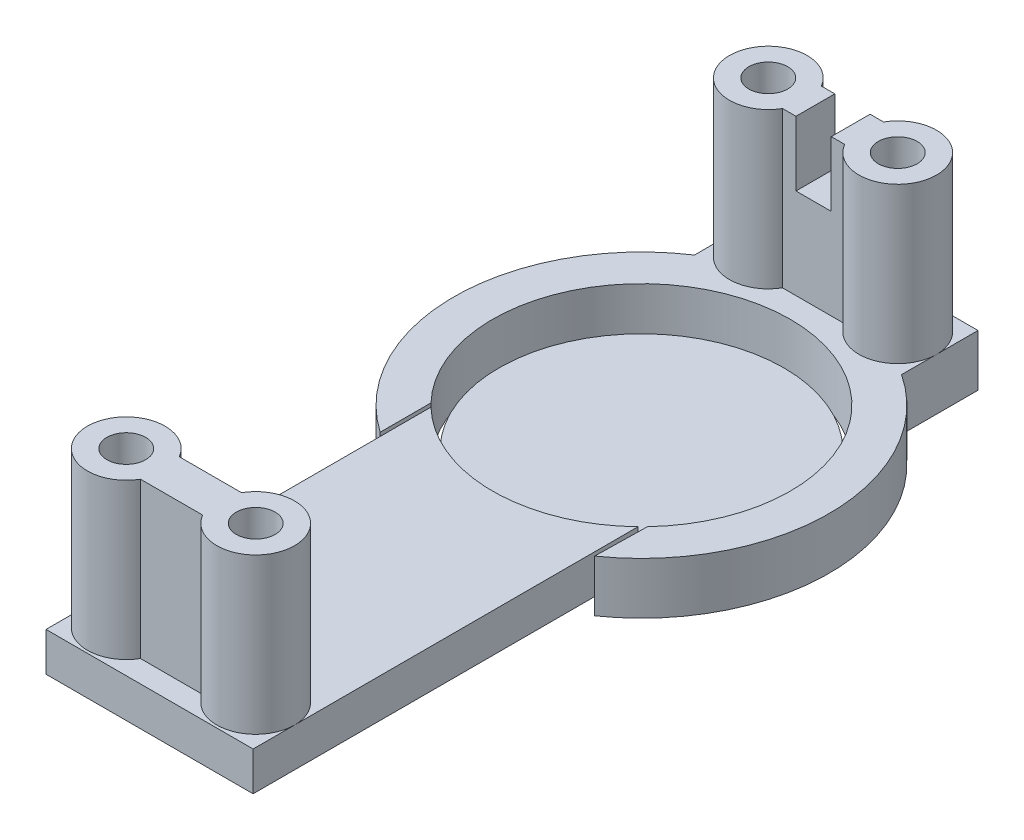
ISO-10303-21;
HEADER;
FILE_DESCRIPTION(('STEP AP214'),'2;1');
FILE_NAME('part.step','',(''),(''),'','','');
FILE_SCHEMA(('AUTOMOTIVE_DESIGN { 1 0 10303 214 1 1 1 1 }'));
ENDSEC;
DATA;
#1=APPLICATION_CONTEXT('core data for automotive mechanical design processes');
#2=APPLICATION_PROTOCOL_DEFINITION('international standard','automotive_design',2000,#1);
#3=PRODUCT_CONTEXT('',#1,'mechanical');
#4=PRODUCT('Part','Part','',(#3));
#5=PRODUCT_RELATED_PRODUCT_CATEGORY('part','',(#4));
#6=PRODUCT_DEFINITION_FORMATION('','',#4);
#7=PRODUCT_DEFINITION_CONTEXT('part definition',#1,'design');
#8=PRODUCT_DEFINITION('design','',#6,#7);
#9=PRODUCT_DEFINITION_SHAPE('','',#8);
#10=(LENGTH_UNIT() NAMED_UNIT(*) SI_UNIT(.MILLI.,.METRE.));
#11=(NAMED_UNIT(*) PLANE_ANGLE_UNIT() SI_UNIT($,.RADIAN.));
#12=(NAMED_UNIT(*) SI_UNIT($,.STERADIAN.) SOLID_ANGLE_UNIT());
#13=UNCERTAINTY_MEASURE_WITH_UNIT(LENGTH_MEASURE(1.E-05),#10,'distance_accuracy_value','');
#14=(GEOMETRIC_REPRESENTATION_CONTEXT(3) GLOBAL_UNCERTAINTY_ASSIGNED_CONTEXT((#13)) GLOBAL_UNIT_ASSIGNED_CONTEXT((#10,
#11,#12)) REPRESENTATION_CONTEXT('',''));
#15=CARTESIAN_POINT('',(0.,0.,0.));
#16=DIRECTION('',(0.,0.,1.));
#17=DIRECTION('',(1.,0.,0.));
#18=AXIS2_PLACEMENT_3D('',#15,#16,#17);
#19=CARTESIAN_POINT('',(0.,-1.,-9.99999999999997));
#20=DIRECTION('',(0.,1.,0.));
#21=DIRECTION('',(0.,0.,1.));
#22=AXIS2_PLACEMENT_3D('',#19,#20,#21);
#23=CYLINDRICAL_SURFACE('',#22,11.);
#24=CARTESIAN_POINT('',(0.,-1.,-9.99999999999997));
#25=DIRECTION('',(0.,-1.,0.));
#26=DIRECTION('',(0.,0.,-1.));
#27=AXIS2_PLACEMENT_3D('',#24,#25,#26);
#28=CIRCLE('',#27,11.);
#29=CARTESIAN_POINT('',(0.,-1.,-21.));
#30=VERTEX_POINT('',#29);
#31=EDGE_CURVE('E11',#30,#30,#28,.T.);
#32=ORIENTED_EDGE('',*,*,#31,.F.);
#33=EDGE_LOOP('',(#32));
#34=FACE_BOUND('',#33,.T.);
#35=CARTESIAN_POINT('',(0.,0.,-9.99999999999997));
#36=DIRECTION('',(0.,-1.,0.));
#37=DIRECTION('',(0.,0.,-1.));
#38=AXIS2_PLACEMENT_3D('',#35,#36,#37);
#39=CIRCLE('',#38,11.);
#40=CARTESIAN_POINT('',(0.,0.,-21.));
#41=VERTEX_POINT('',#40);
#42=EDGE_CURVE('E47',#41,#41,#39,.T.);
#43=ORIENTED_EDGE('',*,*,#42,.T.);
#44=EDGE_LOOP('',(#43));
#45=FACE_BOUND('',#44,.T.);
#46=ADVANCED_FACE('F44',(#34,#45),#23,.T.);
#47=CARTESIAN_POINT('',(0.,-1.,-9.99999999999997));
#48=DIRECTION('',(0.,-1.,0.));
#49=DIRECTION('',(0.,0.,-1.));
#50=AXIS2_PLACEMENT_3D('',#47,#48,#49);
#51=PLANE('',#50);
#52=ORIENTED_EDGE('',*,*,#31,.T.);
#53=EDGE_LOOP('',(#52));
#54=FACE_BOUND('',#53,.T.);
#55=ADVANCED_FACE('F59',(#54),#51,.T.);
#56=CARTESIAN_POINT('',(0.,0.,-9.99999999999997));
#57=DIRECTION('',(0.,-1.,0.));
#58=DIRECTION('',(0.,0.,-1.));
#59=AXIS2_PLACEMENT_3D('',#56,#57,#58);
#60=PLANE('',#59);
#61=ORIENTED_EDGE('',*,*,#42,.F.);
#62=EDGE_LOOP('',(#61));
#63=FACE_BOUND('',#62,.T.);
#64=ADVANCED_FACE('F57',(#63),#60,.F.);
#65=CLOSED_SHELL('',(#46,#55,#64));
#66=MANIFOLD_SOLID_BREP('B2',#65);
#67=CARTESIAN_POINT('',(5.00000000000001,-1.,24.8));
#68=DIRECTION('',(0.,1.,0.));
#69=DIRECTION('',(0.,0.,1.));
#70=AXIS2_PLACEMENT_3D('',#67,#68,#69);
#71=CYLINDRICAL_SURFACE('',#70,1.5);
#72=CARTESIAN_POINT('',(5.00000000000001,-1.,24.8));
#73=DIRECTION('',(0.,-1.,0.));
#74=DIRECTION('',(0.,0.,-1.));
#75=AXIS2_PLACEMENT_3D('',#72,#73,#74);
#76=CIRCLE('',#75,1.5);
#77=CARTESIAN_POINT('',(5.00000000000001,-1.,23.3));
#78=VERTEX_POINT('',#77);
#79=EDGE_CURVE('E43',#78,#78,#76,.T.);
#80=ORIENTED_EDGE('',*,*,#79,.F.);
#81=EDGE_LOOP('',(#80));
#82=FACE_BOUND('',#81,.T.);
#83=CARTESIAN_POINT('',(5.00000000000001,0.,24.8));
#84=DIRECTION('',(0.,-1.,0.));
#85=DIRECTION('',(0.,0.,-1.));
#86=AXIS2_PLACEMENT_3D('',#83,#84,#85);
#87=CIRCLE('',#86,1.5);
#88=CARTESIAN_POINT('',(5.00000000000001,0.,23.3));
#89=VERTEX_POINT('',#88);
#90=EDGE_CURVE('E96',#89,#89,#87,.T.);
#91=ORIENTED_EDGE('',*,*,#90,.T.);
#92=EDGE_LOOP('',(#91));
#93=FACE_BOUND('',#92,.T.);
#94=ADVANCED_FACE('F93',(#82,#93),#71,.T.);
#95=CARTESIAN_POINT('',(5.00000000000001,-1.,24.8));
#96=DIRECTION('',(0.,-1.,0.));
#97=DIRECTION('',(0.,0.,-1.));
#98=AXIS2_PLACEMENT_3D('',#95,#96,#97);
#99=PLANE('',#98);
#100=ORIENTED_EDGE('',*,*,#79,.T.);
#101=EDGE_LOOP('',(#100));
#102=FACE_BOUND('',#101,.T.);
#103=ADVANCED_FACE('F108',(#102),#99,.T.);
#104=CARTESIAN_POINT('',(5.00000000000001,0.,24.8));
#105=DIRECTION('',(0.,-1.,0.));
#106=DIRECTION('',(0.,0.,-1.));
#107=AXIS2_PLACEMENT_3D('',#104,#105,#106);
#108=PLANE('',#107);
#109=ORIENTED_EDGE('',*,*,#90,.F.);
#110=EDGE_LOOP('',(#109));
#111=FACE_BOUND('',#110,.T.);
#112=ADVANCED_FACE('F106',(#111),#108,.F.);
#113=CLOSED_SHELL('',(#94,#103,#112));
#114=MANIFOLD_SOLID_BREP('B6',#113);
#115=CARTESIAN_POINT('',(-4.99999999999999,-1.,24.8));
#116=DIRECTION('',(0.,1.,0.));
#117=DIRECTION('',(0.,0.,1.));
#118=AXIS2_PLACEMENT_3D('',#115,#116,#117);
#119=CYLINDRICAL_SURFACE('',#118,1.5);
#120=CARTESIAN_POINT('',(-4.99999999999999,-1.,24.8));
#121=DIRECTION('',(0.,-1.,0.));
#122=DIRECTION('',(0.,0.,-1.));
#123=AXIS2_PLACEMENT_3D('',#120,#121,#122);
#124=CIRCLE('',#123,1.5);
#125=CARTESIAN_POINT('',(-4.99999999999999,-1.,23.3));
#126=VERTEX_POINT('',#125);
#127=EDGE_CURVE('E92',#126,#126,#124,.T.);
#128=ORIENTED_EDGE('',*,*,#127,.F.);
#129=EDGE_LOOP('',(#128));
#130=FACE_BOUND('',#129,.T.);
#131=CARTESIAN_POINT('',(-4.99999999999999,0.,24.8));
#132=DIRECTION('',(0.,-1.,0.));
#133=DIRECTION('',(0.,0.,-1.));
#134=AXIS2_PLACEMENT_3D('',#131,#132,#133);
#135=CIRCLE('',#134,1.5);
#136=CARTESIAN_POINT('',(-4.99999999999999,0.,23.3));
#137=VERTEX_POINT('',#136);
#138=EDGE_CURVE('E147',#137,#137,#135,.T.);
#139=ORIENTED_EDGE('',*,*,#138,.T.);
#140=EDGE_LOOP('',(#139));
#141=FACE_BOUND('',#140,.T.);
#142=ADVANCED_FACE('F144',(#130,#141),#119,.T.);
#143=CARTESIAN_POINT('',(-4.99999999999999,-1.,24.8));
#144=DIRECTION('',(0.,-1.,0.));
#145=DIRECTION('',(0.,0.,-1.));
#146=AXIS2_PLACEMENT_3D('',#143,#144,#145);
#147=PLANE('',#146);
#148=ORIENTED_EDGE('',*,*,#127,.T.);
#149=EDGE_LOOP('',(#148));
#150=FACE_BOUND('',#149,.T.);
#151=ADVANCED_FACE('F159',(#150),#147,.T.);
#152=CARTESIAN_POINT('',(-4.99999999999999,0.,24.8));
#153=DIRECTION('',(0.,-1.,0.));
#154=DIRECTION('',(0.,0.,-1.));
#155=AXIS2_PLACEMENT_3D('',#152,#153,#154);
#156=PLANE('',#155);
#157=ORIENTED_EDGE('',*,*,#138,.F.);
#158=EDGE_LOOP('',(#157));
#159=FACE_BOUND('',#158,.T.);
#160=ADVANCED_FACE('F157',(#159),#156,.F.);
#161=CLOSED_SHELL('',(#142,#151,#160));
#162=MANIFOLD_SOLID_BREP('B38',#161);
#163=CARTESIAN_POINT('',(0.,15.,0.));
#164=DIRECTION('',(0.,1.,0.));
#165=DIRECTION('',(0.,0.,1.));
#166=AXIS2_PLACEMENT_3D('',#163,#164,#165);
#167=PLANE('',#166);
#168=DIRECTION('',(0.,0.,1.));
#169=VECTOR('',#168,1.);
#170=CARTESIAN_POINT('',(-1.36255157103294,15.,26.3));
#171=LINE('',#170,#169);
#172=CARTESIAN_POINT('',(-1.36255157103294,15.,-26.3));
#173=VERTEX_POINT('',#172);
#174=CARTESIAN_POINT('',(-1.36255157103294,15.,-23.3));
#175=VERTEX_POINT('',#174);
#176=EDGE_CURVE('E362',#173,#175,#171,.T.);
#177=ORIENTED_EDGE('',*,*,#176,.F.);
#178=DIRECTION('',(1.,0.,0.));
#179=VECTOR('',#178,1.);
#180=CARTESIAN_POINT('',(0.,15.,-26.3));
#181=LINE('',#180,#179);
#182=CARTESIAN_POINT('',(-2.40192378864668,15.,-26.3));
#183=VERTEX_POINT('',#182);
#184=EDGE_CURVE('E406',#183,#173,#181,.T.);
#185=ORIENTED_EDGE('',*,*,#184,.F.);
#186=CARTESIAN_POINT('',(-5.,15.,-24.8));
#187=DIRECTION('',(0.,1.,0.));
#188=DIRECTION('',(0.,0.,1.));
#189=AXIS2_PLACEMENT_3D('',#186,#187,#188);
#190=CIRCLE('',#189,3.);
#191=CARTESIAN_POINT('',(-2.40192378864668,15.,-23.3));
#192=VERTEX_POINT('',#191);
#193=EDGE_CURVE('E431',#183,#192,#190,.T.);
#194=ORIENTED_EDGE('',*,*,#193,.T.);
#195=DIRECTION('',(1.,0.,0.));
#196=VECTOR('',#195,1.);
#197=CARTESIAN_POINT('',(0.,15.,-23.3));
#198=LINE('',#197,#196);
#199=EDGE_CURVE('E427',#192,#175,#198,.T.);
#200=ORIENTED_EDGE('',*,*,#199,.T.);
#201=EDGE_LOOP('',(#177,#185,#194,#200));
#202=FACE_BOUND('',#201,.T.);
#203=CARTESIAN_POINT('',(-5.,15.,-24.8));
#204=DIRECTION('',(0.,1.,0.));
#205=DIRECTION('',(0.,0.,1.));
#206=AXIS2_PLACEMENT_3D('',#203,#204,#205);
#207=CIRCLE('',#206,1.5);
#208=CARTESIAN_POINT('',(-5.,15.,-23.3));
#209=VERTEX_POINT('',#208);
#210=EDGE_CURVE('E405',#209,#209,#207,.F.);
#211=ORIENTED_EDGE('',*,*,#210,.T.);
#212=EDGE_LOOP('',(#211));
#213=FACE_BOUND('',#212,.T.);
#214=ADVANCED_FACE('F194',(#202,#213),#167,.T.);
#215=CARTESIAN_POINT('',(0.,3.,0.));
#216=DIRECTION('',(0.,1.,0.));
#217=DIRECTION('',(0.,0.,1.));
#218=AXIS2_PLACEMENT_3D('',#215,#216,#217);
#219=PLANE('',#218);
#220=CARTESIAN_POINT('',(0.,3.,-9.99999999999997));
#221=DIRECTION('',(0.,-1.,0.));
#222=DIRECTION('',(0.,0.,-1.));
#223=AXIS2_PLACEMENT_3D('',#220,#221,#222);
#224=CIRCLE('',#223,11.5);
#225=CARTESIAN_POINT('',(-8.28571428571437,3.,-2.02523111460211));
#226=VERTEX_POINT('',#225);
#227=CARTESIAN_POINT('',(8.36363636363637,3.,-2.10699127221694));
#228=VERTEX_POINT('',#227);
#229=EDGE_CURVE('E217',#226,#228,#224,.T.);
#230=ORIENTED_EDGE('',*,*,#229,.T.);
#231=DIRECTION('',(-0.019445516783248,0.,0.999810918062527));
#232=VECTOR('',#231,1.);
#233=CARTESIAN_POINT('',(8.28571428571429,3.,1.89945119640022));
#234=LINE('',#233,#232);
#235=CARTESIAN_POINT('',(8.28571428571429,3.,1.89945119640022));
#236=VERTEX_POINT('',#235);
#237=EDGE_CURVE('E446',#228,#236,#234,.T.);
#238=ORIENTED_EDGE('',*,*,#237,.T.);
#239=CARTESIAN_POINT('',(0.,3.,-9.99999999999997));
#240=DIRECTION('',(0.,1.,0.));
#241=DIRECTION('',(0.,0.,1.));
#242=AXIS2_PLACEMENT_3D('',#239,#240,#241);
#243=CIRCLE('',#242,14.5);
#244=CARTESIAN_POINT('',(8.,3.,-22.0933866224478));
#245=VERTEX_POINT('',#244);
#246=EDGE_CURVE('E443',#236,#245,#243,.T.);
#247=ORIENTED_EDGE('',*,*,#246,.T.);
#248=DIRECTION('',(0.,0.,-1.));
#249=VECTOR('',#248,1.);
#250=CARTESIAN_POINT('',(8.,3.,-28.));
#251=LINE('',#250,#249);
#252=CARTESIAN_POINT('',(8.,3.,-24.8));
#253=VERTEX_POINT('',#252);
#254=EDGE_CURVE('E445',#245,#253,#251,.T.);
#255=ORIENTED_EDGE('',*,*,#254,.T.);
#256=CARTESIAN_POINT('',(5.,3.,-24.8));
#257=DIRECTION('',(0.,1.,0.));
#258=DIRECTION('',(0.,0.,1.));
#259=AXIS2_PLACEMENT_3D('',#256,#257,#258);
#260=CIRCLE('',#259,3.00000000000001);
#261=CARTESIAN_POINT('',(2.40192378864668,3.,-23.3));
#262=VERTEX_POINT('',#261);
#263=EDGE_CURVE('E395',#262,#253,#260,.T.);
#264=ORIENTED_EDGE('',*,*,#263,.F.);
#265=DIRECTION('',(1.,0.,0.));
#266=VECTOR('',#265,1.);
#267=CARTESIAN_POINT('',(0.,3.,-23.3));
#268=LINE('',#267,#266);
#269=CARTESIAN_POINT('',(-2.40192378864668,3.,-23.3));
#270=VERTEX_POINT('',#269);
#271=EDGE_CURVE('E396',#270,#262,#268,.T.);
#272=ORIENTED_EDGE('',*,*,#271,.F.);
#273=CARTESIAN_POINT('',(-5.,3.,-24.8));
#274=DIRECTION('',(0.,1.,0.));
#275=DIRECTION('',(0.,0.,1.));
#276=AXIS2_PLACEMENT_3D('',#273,#274,#275);
#277=CIRCLE('',#276,3.);
#278=CARTESIAN_POINT('',(-8.,3.,-24.8));
#279=VERTEX_POINT('',#278);
#280=EDGE_CURVE('E410',#279,#270,#277,.T.);
#281=ORIENTED_EDGE('',*,*,#280,.F.);
#282=DIRECTION('',(0.,0.,1.));
#283=VECTOR('',#282,1.);
#284=CARTESIAN_POINT('',(-8.,3.,-28.));
#285=LINE('',#284,#283);
#286=CARTESIAN_POINT('',(-8.,3.,-22.0933866224478));
#287=VERTEX_POINT('',#286);
#288=EDGE_CURVE('E454',#279,#287,#285,.T.);
#289=ORIENTED_EDGE('',*,*,#288,.T.);
#290=CARTESIAN_POINT('',(0.,3.,-9.99999999999997));
#291=DIRECTION('',(0.,1.,0.));
#292=DIRECTION('',(0.,0.,1.));
#293=AXIS2_PLACEMENT_3D('',#290,#291,#292);
#294=CIRCLE('',#293,14.5);
#295=CARTESIAN_POINT('',(-8.28571428571437,3.,1.89945119640022));
#296=VERTEX_POINT('',#295);
#297=EDGE_CURVE('E319',#287,#296,#294,.T.);
#298=ORIENTED_EDGE('',*,*,#297,.T.);
#299=DIRECTION('',(0.,0.,-1.));
#300=VECTOR('',#299,1.);
#301=CARTESIAN_POINT('',(-8.28571428571437,3.,1.89945119640022));
#302=LINE('',#301,#300);
#303=EDGE_CURVE('E324',#296,#226,#302,.T.);
#304=ORIENTED_EDGE('',*,*,#303,.T.);
#305=EDGE_LOOP('',(#230,#238,#247,#255,#264,#272,#281,#289,#298,#304));
#306=FACE_BOUND('',#305,.T.);
#307=ADVANCED_FACE('F458',(#306),#219,.T.);
#308=CARTESIAN_POINT('',(-8.,3.,-28.));
#309=DIRECTION('',(1.,0.,0.));
#310=DIRECTION('',(0.,0.,-1.));
#311=AXIS2_PLACEMENT_3D('',#308,#309,#310);
#312=PLANE('',#311);
#313=DIRECTION('',(0.,-1.,0.));
#314=VECTOR('',#313,1.);
#315=CARTESIAN_POINT('',(-8.,3.,-28.));
#316=LINE('',#315,#314);
#317=CARTESIAN_POINT('',(-8.,3.,-28.));
#318=VERTEX_POINT('',#317);
#319=CARTESIAN_POINT('',(-8.,-1.,-28.));
#320=VERTEX_POINT('',#319);
#321=EDGE_CURVE('E323',#318,#320,#316,.T.);
#322=ORIENTED_EDGE('',*,*,#321,.T.);
#323=DIRECTION('',(0.,0.,-1.));
#324=VECTOR('',#323,1.);
#325=CARTESIAN_POINT('',(-8.,-1.,-22.0933866224478));
#326=LINE('',#325,#324);
#327=CARTESIAN_POINT('',(-8.,-1.,-22.0933866224478));
#328=VERTEX_POINT('',#327);
#329=EDGE_CURVE('E327',#328,#320,#326,.T.);
#330=ORIENTED_EDGE('',*,*,#329,.F.);
#331=DIRECTION('',(0.,1.,0.));
#332=VECTOR('',#331,1.);
#333=CARTESIAN_POINT('',(-8.,0.,-22.0933866224478));
#334=LINE('',#333,#332);
#335=EDGE_CURVE('E313',#328,#287,#334,.T.);
#336=ORIENTED_EDGE('',*,*,#335,.T.);
#337=ORIENTED_EDGE('',*,*,#288,.F.);
#338=EDGE_CURVE('E386',#318,#279,#285,.T.);
#339=ORIENTED_EDGE('',*,*,#338,.F.);
#340=EDGE_LOOP('',(#322,#330,#336,#337,#339));
#341=FACE_BOUND('',#340,.T.);
#342=ADVANCED_FACE('F328',(#341),#312,.F.);
#343=CARTESIAN_POINT('',(-2.40192378864668,3.,-26.3));
#344=VERTEX_POINT('',#343);
#345=EDGE_CURVE('E385',#344,#279,#277,.T.);
#346=ORIENTED_EDGE('',*,*,#345,.F.);
#347=DIRECTION('',(1.,0.,0.));
#348=VECTOR('',#347,1.);
#349=CARTESIAN_POINT('',(0.,3.,-26.3));
#350=LINE('',#349,#348);
#351=CARTESIAN_POINT('',(2.40192378864668,3.,-26.3));
#352=VERTEX_POINT('',#351);
#353=EDGE_CURVE('E388',#344,#352,#350,.T.);
#354=ORIENTED_EDGE('',*,*,#353,.T.);
#355=EDGE_CURVE('E401',#253,#352,#260,.T.);
#356=ORIENTED_EDGE('',*,*,#355,.F.);
#357=CARTESIAN_POINT('',(8.,3.,-28.));
#358=VERTEX_POINT('',#357);
#359=EDGE_CURVE('E391',#253,#358,#251,.T.);
#360=ORIENTED_EDGE('',*,*,#359,.T.);
#361=DIRECTION('',(-1.,0.,0.));
#362=VECTOR('',#361,1.);
#363=CARTESIAN_POINT('',(-8.,3.,-28.));
#364=LINE('',#363,#362);
#365=EDGE_CURVE('E389',#358,#318,#364,.T.);
#366=ORIENTED_EDGE('',*,*,#365,.T.);
#367=ORIENTED_EDGE('',*,*,#338,.T.);
#368=EDGE_LOOP('',(#346,#354,#356,#360,#366,#367));
#369=FACE_BOUND('',#368,.T.);
#370=ADVANCED_FACE('F476',(#369),#219,.T.);
#371=CARTESIAN_POINT('',(8.,3.,-28.));
#372=DIRECTION('',(-1.,0.,0.));
#373=DIRECTION('',(0.,0.,1.));
#374=AXIS2_PLACEMENT_3D('',#371,#372,#373);
#375=PLANE('',#374);
#376=ORIENTED_EDGE('',*,*,#254,.F.);
#377=DIRECTION('',(0.,1.,0.));
#378=VECTOR('',#377,1.);
#379=CARTESIAN_POINT('',(8.00000000000001,0.,-22.0933866224478));
#380=LINE('',#379,#378);
#381=CARTESIAN_POINT('',(8.00000000000001,-1.,-22.0933866224478));
#382=VERTEX_POINT('',#381);
#383=EDGE_CURVE('E437',#382,#245,#380,.T.);
#384=ORIENTED_EDGE('',*,*,#383,.F.);
#385=DIRECTION('',(0.,0.,1.));
#386=VECTOR('',#385,1.);
#387=CARTESIAN_POINT('',(8.,-1.,-28.));
#388=LINE('',#387,#386);
#389=CARTESIAN_POINT('',(8.,-1.,-28.));
#390=VERTEX_POINT('',#389);
#391=EDGE_CURVE('E350',#390,#382,#388,.T.);
#392=ORIENTED_EDGE('',*,*,#391,.F.);
#393=DIRECTION('',(0.,-1.,0.));
#394=VECTOR('',#393,1.);
#395=CARTESIAN_POINT('',(8.,3.,-28.));
#396=LINE('',#395,#394);
#397=EDGE_CURVE('E383',#358,#390,#396,.T.);
#398=ORIENTED_EDGE('',*,*,#397,.F.);
#399=ORIENTED_EDGE('',*,*,#359,.F.);
#400=EDGE_LOOP('',(#376,#384,#392,#398,#399));
#401=FACE_BOUND('',#400,.T.);
#402=ADVANCED_FACE('F196',(#401),#375,.F.);
#403=CARTESIAN_POINT('',(-8.,3.,-28.));
#404=DIRECTION('',(0.,0.,1.));
#405=DIRECTION('',(1.,0.,0.));
#406=AXIS2_PLACEMENT_3D('',#403,#404,#405);
#407=PLANE('',#406);
#408=ORIENTED_EDGE('',*,*,#397,.T.);
#409=DIRECTION('',(1.,0.,0.));
#410=VECTOR('',#409,1.);
#411=CARTESIAN_POINT('',(-8.,-1.,-28.));
#412=LINE('',#411,#410);
#413=EDGE_CURVE('E334',#320,#390,#412,.T.);
#414=ORIENTED_EDGE('',*,*,#413,.F.);
#415=ORIENTED_EDGE('',*,*,#321,.F.);
#416=ORIENTED_EDGE('',*,*,#365,.F.);
#417=EDGE_LOOP('',(#408,#414,#415,#416));
#418=FACE_BOUND('',#417,.T.);
#419=ADVANCED_FACE('F496',(#418),#407,.F.);
#420=CARTESIAN_POINT('',(-5.,3.,-24.8));
#421=DIRECTION('',(0.,-1.,0.));
#422=DIRECTION('',(0.,0.,-1.));
#423=AXIS2_PLACEMENT_3D('',#420,#421,#422);
#424=CYLINDRICAL_SURFACE('',#423,1.5);
#425=ORIENTED_EDGE('',*,*,#210,.F.);
#426=EDGE_LOOP('',(#425));
#427=FACE_BOUND('',#426,.T.);
#428=CARTESIAN_POINT('',(-5.,-1.,-24.8));
#429=DIRECTION('',(0.,-1.,0.));
#430=DIRECTION('',(0.,0.,-1.));
#431=AXIS2_PLACEMENT_3D('',#428,#429,#430);
#432=CIRCLE('',#431,1.5);
#433=CARTESIAN_POINT('',(-5.,-1.,-26.3));
#434=VERTEX_POINT('',#433);
#435=EDGE_CURVE('E342',#434,#434,#432,.T.);
#436=ORIENTED_EDGE('',*,*,#435,.T.);
#437=EDGE_LOOP('',(#436));
#438=FACE_BOUND('',#437,.T.);
#439=ADVANCED_FACE('F540',(#427,#438),#424,.F.);
#440=CARTESIAN_POINT('',(5.,3.,-24.8));
#441=DIRECTION('',(0.,-1.,0.));
#442=DIRECTION('',(0.,0.,-1.));
#443=AXIS2_PLACEMENT_3D('',#440,#441,#442);
#444=CYLINDRICAL_SURFACE('',#443,1.5);
#445=CARTESIAN_POINT('',(5.,15.,-24.8));
#446=DIRECTION('',(0.,1.,0.));
#447=DIRECTION('',(0.,0.,1.));
#448=AXIS2_PLACEMENT_3D('',#445,#446,#447);
#449=CIRCLE('',#448,1.5);
#450=CARTESIAN_POINT('',(5.,15.,-23.3));
#451=VERTEX_POINT('',#450);
#452=EDGE_CURVE('E418',#451,#451,#449,.F.);
#453=ORIENTED_EDGE('',*,*,#452,.F.);
#454=EDGE_LOOP('',(#453));
#455=FACE_BOUND('',#454,.T.);
#456=CARTESIAN_POINT('',(5.,-1.,-24.8));
#457=DIRECTION('',(0.,-1.,0.));
#458=DIRECTION('',(0.,0.,-1.));
#459=AXIS2_PLACEMENT_3D('',#456,#457,#458);
#460=CIRCLE('',#459,1.5);
#461=CARTESIAN_POINT('',(5.,-1.,-26.3));
#462=VERTEX_POINT('',#461);
#463=EDGE_CURVE('E345',#462,#462,#460,.T.);
#464=ORIENTED_EDGE('',*,*,#463,.T.);
#465=EDGE_LOOP('',(#464));
#466=FACE_BOUND('',#465,.T.);
#467=ADVANCED_FACE('F537',(#455,#466),#444,.F.);
#468=CARTESIAN_POINT('',(-5.,15.,-24.8));
#469=DIRECTION('',(0.,-1.,0.));
#470=DIRECTION('',(0.,0.,-1.));
#471=AXIS2_PLACEMENT_3D('',#468,#469,#470);
#472=CYLINDRICAL_SURFACE('',#471,3.);
#473=ORIENTED_EDGE('',*,*,#345,.T.);
#474=ORIENTED_EDGE('',*,*,#280,.T.);
#475=DIRECTION('',(0.,-1.,0.));
#476=VECTOR('',#475,1.);
#477=CARTESIAN_POINT('',(-2.40192378864668,15.,-23.3));
#478=LINE('',#477,#476);
#479=EDGE_CURVE('E392',#192,#270,#478,.T.);
#480=ORIENTED_EDGE('',*,*,#479,.F.);
#481=ORIENTED_EDGE('',*,*,#193,.F.);
#482=DIRECTION('',(0.,-1.,0.));
#483=VECTOR('',#482,1.);
#484=CARTESIAN_POINT('',(-2.40192378864668,15.,-26.3));
#485=LINE('',#484,#483);
#486=EDGE_CURVE('E407',#183,#344,#485,.T.);
#487=ORIENTED_EDGE('',*,*,#486,.T.);
#488=EDGE_LOOP('',(#473,#474,#480,#481,#487));
#489=FACE_BOUND('',#488,.T.);
#490=ADVANCED_FACE('F493',(#489),#472,.T.);
#491=CARTESIAN_POINT('',(0.,15.,-23.3));
#492=DIRECTION('',(0.,0.,-1.));
#493=DIRECTION('',(-1.,0.,0.));
#494=AXIS2_PLACEMENT_3D('',#491,#492,#493);
#495=PLANE('',#494);
#496=DIRECTION('',(1.,0.,0.));
#497=VECTOR('',#496,1.);
#498=CARTESIAN_POINT('',(0.,10.,-23.3));
#499=LINE('',#498,#497);
#500=CARTESIAN_POINT('',(-1.36255157103294,10.,-23.3));
#501=VERTEX_POINT('',#500);
#502=CARTESIAN_POINT('',(1.36255157103295,10.,-23.3));
#503=VERTEX_POINT('',#502);
#504=EDGE_CURVE('E381',#501,#503,#499,.T.);
#505=ORIENTED_EDGE('',*,*,#504,.F.);
#506=DIRECTION('',(0.,1.,0.));
#507=VECTOR('',#506,1.);
#508=CARTESIAN_POINT('',(-1.36255157103294,15.,-23.3));
#509=LINE('',#508,#507);
#510=EDGE_CURVE('E378',#501,#175,#509,.T.);
#511=ORIENTED_EDGE('',*,*,#510,.T.);
#512=ORIENTED_EDGE('',*,*,#199,.F.);
#513=ORIENTED_EDGE('',*,*,#479,.T.);
#514=ORIENTED_EDGE('',*,*,#271,.T.);
#515=DIRECTION('',(0.,-1.,0.));
#516=VECTOR('',#515,1.);
#517=CARTESIAN_POINT('',(2.40192378864668,15.,-23.3));
#518=LINE('',#517,#516);
#519=CARTESIAN_POINT('',(2.40192378864668,15.,-23.3));
#520=VERTEX_POINT('',#519);
#521=EDGE_CURVE('E397',#520,#262,#518,.T.);
#522=ORIENTED_EDGE('',*,*,#521,.F.);
#523=CARTESIAN_POINT('',(1.36255157103295,15.,-23.3));
#524=VERTEX_POINT('',#523);
#525=EDGE_CURVE('E430',#524,#520,#198,.T.);
#526=ORIENTED_EDGE('',*,*,#525,.F.);
#527=DIRECTION('',(0.,-1.,0.));
#528=VECTOR('',#527,1.);
#529=CARTESIAN_POINT('',(1.36255157103295,15.,-23.3));
#530=LINE('',#529,#528);
#531=EDGE_CURVE('E208',#524,#503,#530,.T.);
#532=ORIENTED_EDGE('',*,*,#531,.T.);
#533=EDGE_LOOP('',(#505,#511,#512,#513,#514,#522,#526,#532));
#534=FACE_BOUND('',#533,.T.);
#535=ADVANCED_FACE('F489',(#534),#495,.F.);
#536=CARTESIAN_POINT('',(5.,15.,-24.8));
#537=DIRECTION('',(0.,-1.,0.));
#538=DIRECTION('',(0.,0.,-1.));
#539=AXIS2_PLACEMENT_3D('',#536,#537,#538);
#540=CYLINDRICAL_SURFACE('',#539,3.00000000000001);
#541=ORIENTED_EDGE('',*,*,#263,.T.);
#542=ORIENTED_EDGE('',*,*,#355,.T.);
#543=DIRECTION('',(0.,-1.,0.));
#544=VECTOR('',#543,1.);
#545=CARTESIAN_POINT('',(2.40192378864668,15.,-26.3));
#546=LINE('',#545,#544);
#547=CARTESIAN_POINT('',(2.40192378864668,15.,-26.3));
#548=VERTEX_POINT('',#547);
#549=EDGE_CURVE('E402',#548,#352,#546,.T.);
#550=ORIENTED_EDGE('',*,*,#549,.F.);
#551=CARTESIAN_POINT('',(5.,15.,-24.8));
#552=DIRECTION('',(0.,1.,0.));
#553=DIRECTION('',(0.,0.,1.));
#554=AXIS2_PLACEMENT_3D('',#551,#552,#553);
#555=CIRCLE('',#554,3.00000000000001);
#556=EDGE_CURVE('E422',#520,#548,#555,.T.);
#557=ORIENTED_EDGE('',*,*,#556,.F.);
#558=ORIENTED_EDGE('',*,*,#521,.T.);
#559=EDGE_LOOP('',(#541,#542,#550,#557,#558));
#560=FACE_BOUND('',#559,.T.);
#561=ADVANCED_FACE('F483',(#560),#540,.T.);
#562=CARTESIAN_POINT('',(0.,15.,-26.3));
#563=DIRECTION('',(0.,0.,-1.));
#564=DIRECTION('',(-1.,0.,0.));
#565=AXIS2_PLACEMENT_3D('',#562,#563,#564);
#566=PLANE('',#565);
#567=DIRECTION('',(0.,1.,0.));
#568=VECTOR('',#567,1.);
#569=CARTESIAN_POINT('',(-1.36255157103294,10.,-26.3));
#570=LINE('',#569,#568);
#571=CARTESIAN_POINT('',(-1.36255157103294,10.,-26.3));
#572=VERTEX_POINT('',#571);
#573=EDGE_CURVE('E373',#572,#173,#570,.T.);
#574=ORIENTED_EDGE('',*,*,#573,.F.);
#575=DIRECTION('',(-1.,0.,0.));
#576=VECTOR('',#575,1.);
#577=CARTESIAN_POINT('',(1.36255157103295,10.,-26.3));
#578=LINE('',#577,#576);
#579=CARTESIAN_POINT('',(1.36255157103295,10.,-26.3));
#580=VERTEX_POINT('',#579);
#581=EDGE_CURVE('E368',#580,#572,#578,.T.);
#582=ORIENTED_EDGE('',*,*,#581,.F.);
#583=DIRECTION('',(0.,1.,0.));
#584=VECTOR('',#583,1.);
#585=CARTESIAN_POINT('',(1.36255157103295,10.,-26.3));
#586=LINE('',#585,#584);
#587=CARTESIAN_POINT('',(1.36255157103295,15.,-26.3));
#588=VERTEX_POINT('',#587);
#589=EDGE_CURVE('E371',#580,#588,#586,.T.);
#590=ORIENTED_EDGE('',*,*,#589,.T.);
#591=EDGE_CURVE('E400',#588,#548,#181,.T.);
#592=ORIENTED_EDGE('',*,*,#591,.T.);
#593=ORIENTED_EDGE('',*,*,#549,.T.);
#594=ORIENTED_EDGE('',*,*,#353,.F.);
#595=ORIENTED_EDGE('',*,*,#486,.F.);
#596=ORIENTED_EDGE('',*,*,#184,.T.);
#597=EDGE_LOOP('',(#574,#582,#590,#592,#593,#594,#595,#596));
#598=FACE_BOUND('',#597,.T.);
#599=ADVANCED_FACE('F525',(#598),#566,.T.);
#600=DIRECTION('',(0.,0.,-1.));
#601=VECTOR('',#600,1.);
#602=CARTESIAN_POINT('',(1.36255157103295,15.,0.));
#603=LINE('',#602,#601);
#604=EDGE_CURVE('E142',#524,#588,#603,.T.);
#605=ORIENTED_EDGE('',*,*,#604,.F.);
#606=ORIENTED_EDGE('',*,*,#525,.T.);
#607=ORIENTED_EDGE('',*,*,#556,.T.);
#608=ORIENTED_EDGE('',*,*,#591,.F.);
#609=EDGE_LOOP('',(#605,#606,#607,#608));
#610=FACE_BOUND('',#609,.T.);
#611=ORIENTED_EDGE('',*,*,#452,.T.);
#612=EDGE_LOOP('',(#611));
#613=FACE_BOUND('',#612,.T.);
#614=ADVANCED_FACE('F514',(#610,#613),#167,.T.);
#615=CARTESIAN_POINT('',(0.,0.,-9.99999999999997));
#616=DIRECTION('',(0.,1.,0.));
#617=DIRECTION('',(0.,0.,1.));
#618=AXIS2_PLACEMENT_3D('',#615,#616,#617);
#619=CYLINDRICAL_SURFACE('',#618,11.5);
#620=DIRECTION('',(0.,1.,0.));
#621=VECTOR('',#620,1.);
#622=CARTESIAN_POINT('',(8.36363636363637,0.,-2.10699127221694));
#623=LINE('',#622,#621);
#624=CARTESIAN_POINT('',(8.36363636363637,-1.,-2.10699127221694));
#625=VERTEX_POINT('',#624);
#626=EDGE_CURVE('E421',#625,#228,#623,.T.);
#627=ORIENTED_EDGE('',*,*,#626,.T.);
#628=ORIENTED_EDGE('',*,*,#229,.F.);
#629=DIRECTION('',(0.,1.,0.));
#630=VECTOR('',#629,1.);
#631=CARTESIAN_POINT('',(-8.28571428571437,0.,-2.02523111460211));
#632=LINE('',#631,#630);
#633=CARTESIAN_POINT('',(-8.28571428571437,-1.,-2.02523111460211));
#634=VERTEX_POINT('',#633);
#635=EDGE_CURVE('E202',#634,#226,#632,.T.);
#636=ORIENTED_EDGE('',*,*,#635,.F.);
#637=CARTESIAN_POINT('',(0.,-1.,-9.99999999999997));
#638=DIRECTION('',(0.,1.,0.));
#639=DIRECTION('',(0.,0.,-1.));
#640=AXIS2_PLACEMENT_3D('',#637,#638,#639);
#641=CIRCLE('',#640,11.5);
#642=EDGE_CURVE('E359',#625,#634,#641,.T.);
#643=ORIENTED_EDGE('',*,*,#642,.F.);
#644=EDGE_LOOP('',(#627,#628,#636,#643));
#645=FACE_BOUND('',#644,.T.);
#646=ADVANCED_FACE('F462',(#645),#619,.F.);
#647=CARTESIAN_POINT('',(0.,0.,-9.99999999999997));
#648=DIRECTION('',(0.,1.,0.));
#649=DIRECTION('',(0.,0.,1.));
#650=AXIS2_PLACEMENT_3D('',#647,#648,#649);
#651=CYLINDRICAL_SURFACE('',#650,14.5);
#652=ORIENTED_EDGE('',*,*,#246,.F.);
#653=DIRECTION('',(0.,1.,0.));
#654=VECTOR('',#653,1.);
#655=CARTESIAN_POINT('',(8.28571428571429,0.,1.89945119640022));
#656=LINE('',#655,#654);
#657=CARTESIAN_POINT('',(8.28571428571429,-1.,1.89945119640022));
#658=VERTEX_POINT('',#657);
#659=EDGE_CURVE('E438',#658,#236,#656,.T.);
#660=ORIENTED_EDGE('',*,*,#659,.F.);
#661=CARTESIAN_POINT('',(0.,-1.,-9.99999999999997));
#662=DIRECTION('',(0.,-1.,0.));
#663=DIRECTION('',(0.,0.,-1.));
#664=AXIS2_PLACEMENT_3D('',#661,#662,#663);
#665=CIRCLE('',#664,14.5);
#666=EDGE_CURVE('E353',#382,#658,#665,.T.);
#667=ORIENTED_EDGE('',*,*,#666,.F.);
#668=ORIENTED_EDGE('',*,*,#383,.T.);
#669=EDGE_LOOP('',(#652,#660,#667,#668));
#670=FACE_BOUND('',#669,.T.);
#671=ADVANCED_FACE('F469',(#670),#651,.T.);
#672=CARTESIAN_POINT('',(8.28571428571429,0.,1.89945119640022));
#673=DIRECTION('',(-0.999810918062527,0.,-0.019445516783248));
#674=DIRECTION('',(-0.019445516783248,0.,0.999810918062527));
#675=AXIS2_PLACEMENT_3D('',#672,#673,#674);
#676=PLANE('',#675);
#677=ORIENTED_EDGE('',*,*,#237,.F.);
#678=ORIENTED_EDGE('',*,*,#626,.F.);
#679=DIRECTION('',(0.019445516783248,0.,-0.999810918062527));
#680=VECTOR('',#679,1.);
#681=CARTESIAN_POINT('',(8.28571428571429,-1.,1.89945119640022));
#682=LINE('',#681,#680);
#683=EDGE_CURVE('E356',#658,#625,#682,.T.);
#684=ORIENTED_EDGE('',*,*,#683,.F.);
#685=ORIENTED_EDGE('',*,*,#659,.T.);
#686=EDGE_LOOP('',(#677,#678,#684,#685));
#687=FACE_BOUND('',#686,.T.);
#688=ADVANCED_FACE('F465',(#687),#676,.T.);
#689=CARTESIAN_POINT('',(0.,0.,-9.99999999999997));
#690=DIRECTION('',(0.,1.,0.));
#691=DIRECTION('',(0.,0.,1.));
#692=AXIS2_PLACEMENT_3D('',#689,#690,#691);
#693=CYLINDRICAL_SURFACE('',#692,14.5);
#694=ORIENTED_EDGE('',*,*,#297,.F.);
#695=ORIENTED_EDGE('',*,*,#335,.F.);
#696=CARTESIAN_POINT('',(0.,-1.,-9.99999999999997));
#697=DIRECTION('',(0.,-1.,0.));
#698=DIRECTION('',(0.,0.,-1.));
#699=AXIS2_PLACEMENT_3D('',#696,#697,#698);
#700=CIRCLE('',#699,14.5);
#701=CARTESIAN_POINT('',(-8.28571428571437,-1.,1.89945119640022));
#702=VERTEX_POINT('',#701);
#703=EDGE_CURVE('E317',#702,#328,#700,.T.);
#704=ORIENTED_EDGE('',*,*,#703,.F.);
#705=DIRECTION('',(0.,1.,0.));
#706=VECTOR('',#705,1.);
#707=CARTESIAN_POINT('',(-8.28571428571437,0.,1.89945119640022));
#708=LINE('',#707,#706);
#709=EDGE_CURVE('E440',#702,#296,#708,.T.);
#710=ORIENTED_EDGE('',*,*,#709,.T.);
#711=EDGE_LOOP('',(#694,#695,#704,#710));
#712=FACE_BOUND('',#711,.T.);
#713=ADVANCED_FACE('F315',(#712),#693,.T.);
#714=CARTESIAN_POINT('',(-8.28571428571437,0.,1.89945119640022));
#715=DIRECTION('',(1.,0.,0.));
#716=DIRECTION('',(0.,0.,-1.));
#717=AXIS2_PLACEMENT_3D('',#714,#715,#716);
#718=PLANE('',#717);
#719=ORIENTED_EDGE('',*,*,#303,.F.);
#720=ORIENTED_EDGE('',*,*,#709,.F.);
#721=DIRECTION('',(0.,0.,1.));
#722=VECTOR('',#721,1.);
#723=CARTESIAN_POINT('',(-8.28571428571437,-1.,-2.02523111460211));
#724=LINE('',#723,#722);
#725=EDGE_CURVE('E341',#634,#702,#724,.T.);
#726=ORIENTED_EDGE('',*,*,#725,.F.);
#727=ORIENTED_EDGE('',*,*,#635,.T.);
#728=EDGE_LOOP('',(#719,#720,#726,#727));
#729=FACE_BOUND('',#728,.T.);
#730=ADVANCED_FACE('F498',(#729),#718,.T.);
#731=CARTESIAN_POINT('',(0.,10.,0.));
#732=DIRECTION('',(0.,1.,0.));
#733=DIRECTION('',(0.,0.,1.));
#734=AXIS2_PLACEMENT_3D('',#731,#732,#733);
#735=PLANE('',#734);
#736=ORIENTED_EDGE('',*,*,#504,.T.);
#737=DIRECTION('',(0.,0.,-1.));
#738=VECTOR('',#737,1.);
#739=CARTESIAN_POINT('',(1.36255157103295,10.,26.3));
#740=LINE('',#739,#738);
#741=EDGE_CURVE('E366',#503,#580,#740,.T.);
#742=ORIENTED_EDGE('',*,*,#741,.T.);
#743=ORIENTED_EDGE('',*,*,#581,.T.);
#744=DIRECTION('',(0.,0.,1.));
#745=VECTOR('',#744,1.);
#746=CARTESIAN_POINT('',(-1.36255157103294,10.,26.3));
#747=LINE('',#746,#745);
#748=EDGE_CURVE('E363',#572,#501,#747,.T.);
#749=ORIENTED_EDGE('',*,*,#748,.T.);
#750=EDGE_LOOP('',(#736,#742,#743,#749));
#751=FACE_BOUND('',#750,.T.);
#752=ADVANCED_FACE('F500',(#751),#735,.T.);
#753=CARTESIAN_POINT('',(-1.36255157103294,10.,26.3));
#754=DIRECTION('',(-1.,0.,0.));
#755=DIRECTION('',(0.,0.,1.));
#756=AXIS2_PLACEMENT_3D('',#753,#754,#755);
#757=PLANE('',#756);
#758=ORIENTED_EDGE('',*,*,#748,.F.);
#759=ORIENTED_EDGE('',*,*,#573,.T.);
#760=ORIENTED_EDGE('',*,*,#176,.T.);
#761=ORIENTED_EDGE('',*,*,#510,.F.);
#762=EDGE_LOOP('',(#758,#759,#760,#761));
#763=FACE_BOUND('',#762,.T.);
#764=ADVANCED_FACE('F506',(#763),#757,.F.);
#765=CARTESIAN_POINT('',(1.36255157103295,10.,26.3));
#766=DIRECTION('',(1.,0.,0.));
#767=DIRECTION('',(0.,0.,-1.));
#768=AXIS2_PLACEMENT_3D('',#765,#766,#767);
#769=PLANE('',#768);
#770=ORIENTED_EDGE('',*,*,#604,.T.);
#771=ORIENTED_EDGE('',*,*,#589,.F.);
#772=ORIENTED_EDGE('',*,*,#741,.F.);
#773=ORIENTED_EDGE('',*,*,#531,.F.);
#774=EDGE_LOOP('',(#770,#771,#772,#773));
#775=FACE_BOUND('',#774,.T.);
#776=ADVANCED_FACE('F545',(#775),#769,.F.);
#777=CARTESIAN_POINT('',(0.,-1.,-9.99999999999997));
#778=DIRECTION('',(0.,-1.,0.));
#779=DIRECTION('',(0.,0.,-1.));
#780=AXIS2_PLACEMENT_3D('',#777,#778,#779);
#781=PLANE('',#780);
#782=ORIENTED_EDGE('',*,*,#435,.F.);
#783=EDGE_LOOP('',(#782));
#784=FACE_BOUND('',#783,.T.);
#785=ORIENTED_EDGE('',*,*,#703,.T.);
#786=ORIENTED_EDGE('',*,*,#329,.T.);
#787=ORIENTED_EDGE('',*,*,#413,.T.);
#788=ORIENTED_EDGE('',*,*,#391,.T.);
#789=ORIENTED_EDGE('',*,*,#666,.T.);
#790=ORIENTED_EDGE('',*,*,#683,.T.);
#791=ORIENTED_EDGE('',*,*,#642,.T.);
#792=ORIENTED_EDGE('',*,*,#725,.T.);
#793=EDGE_LOOP('',(#785,#786,#787,#788,#789,#790,#791,#792));
#794=FACE_BOUND('',#793,.T.);
#795=ORIENTED_EDGE('',*,*,#463,.F.);
#796=EDGE_LOOP('',(#795));
#797=FACE_BOUND('',#796,.T.);
#798=ADVANCED_FACE('F337',(#784,#794,#797),#781,.T.);
#799=CLOSED_SHELL('',(#214,#307,#342,#370,#402,#419,#439,#467,#490,#535,#561,#599,#614,#646,
#671,#688,#713,#730,#752,#764,#776,#798));
#800=MANIFOLD_SOLID_BREP('B87',#799);
#801=CARTESIAN_POINT('',(0.,15.,0.));
#802=DIRECTION('',(0.,1.,0.));
#803=DIRECTION('',(0.,0.,1.));
#804=AXIS2_PLACEMENT_3D('',#801,#802,#803);
#805=PLANE('',#804);
#806=CARTESIAN_POINT('',(-4.99999999999999,15.,24.8));
#807=DIRECTION('',(0.,1.,0.));
#808=DIRECTION('',(0.,0.,1.));
#809=AXIS2_PLACEMENT_3D('',#806,#807,#808);
#810=CIRCLE('',#809,1.5);
#811=CARTESIAN_POINT('',(-4.99999999999999,15.,26.3));
#812=VERTEX_POINT('',#811);
#813=EDGE_CURVE('E901',#812,#812,#810,.F.);
#814=ORIENTED_EDGE('',*,*,#813,.T.);
#815=EDGE_LOOP('',(#814));
#816=FACE_BOUND('',#815,.T.);
#817=CARTESIAN_POINT('',(-4.99999999999999,15.,24.8));
#818=DIRECTION('',(0.,1.,0.));
#819=DIRECTION('',(0.,0.,1.));
#820=AXIS2_PLACEMENT_3D('',#817,#818,#819);
#821=CIRCLE('',#820,3.00000000000001);
#822=CARTESIAN_POINT('',(-2.40192378864667,15.,23.3));
#823=VERTEX_POINT('',#822);
#824=CARTESIAN_POINT('',(-2.40192378864667,15.,26.3));
#825=VERTEX_POINT('',#824);
#826=EDGE_CURVE('E918',#823,#825,#821,.T.);
#827=ORIENTED_EDGE('',*,*,#826,.T.);
#828=DIRECTION('',(1.,0.,0.));
#829=VECTOR('',#828,1.);
#830=CARTESIAN_POINT('',(0.,15.,26.3));
#831=LINE('',#830,#829);
#832=CARTESIAN_POINT('',(2.40192378864668,15.,26.3));
#833=VERTEX_POINT('',#832);
#834=EDGE_CURVE('E916',#825,#833,#831,.T.);
#835=ORIENTED_EDGE('',*,*,#834,.T.);
#836=CARTESIAN_POINT('',(5.00000000000001,15.,24.8));
#837=DIRECTION('',(0.,1.,0.));
#838=DIRECTION('',(0.,0.,1.));
#839=AXIS2_PLACEMENT_3D('',#836,#837,#838);
#840=CIRCLE('',#839,3.);
#841=CARTESIAN_POINT('',(2.40192378864668,15.,23.3));
#842=VERTEX_POINT('',#841);
#843=EDGE_CURVE('E914',#833,#842,#840,.T.);
#844=ORIENTED_EDGE('',*,*,#843,.T.);
#845=DIRECTION('',(1.,0.,0.));
#846=VECTOR('',#845,1.);
#847=CARTESIAN_POINT('',(0.,15.,23.3));
#848=LINE('',#847,#846);
#849=EDGE_CURVE('E911',#823,#842,#848,.T.);
#850=ORIENTED_EDGE('',*,*,#849,.F.);
#851=EDGE_LOOP('',(#827,#835,#844,#850));
#852=FACE_BOUND('',#851,.T.);
#853=CARTESIAN_POINT('',(5.00000000000001,15.,24.8));
#854=DIRECTION('',(0.,1.,0.));
#855=DIRECTION('',(0.,0.,1.));
#856=AXIS2_PLACEMENT_3D('',#853,#854,#855);
#857=CIRCLE('',#856,1.5);
#858=CARTESIAN_POINT('',(5.00000000000001,15.,26.3));
#859=VERTEX_POINT('',#858);
#860=EDGE_CURVE('E898',#859,#859,#857,.F.);
#861=ORIENTED_EDGE('',*,*,#860,.T.);
#862=EDGE_LOOP('',(#861));
#863=FACE_BOUND('',#862,.T.);
#864=ADVANCED_FACE('F770',(#816,#852,#863),#805,.T.);
#865=CARTESIAN_POINT('',(0.,15.,26.3));
#866=DIRECTION('',(0.,0.,-1.));
#867=DIRECTION('',(-1.,0.,0.));
#868=AXIS2_PLACEMENT_3D('',#865,#866,#867);
#869=PLANE('',#868);
#870=DIRECTION('',(1.,0.,0.));
#871=VECTOR('',#870,1.);
#872=CARTESIAN_POINT('',(0.,3.,26.3));
#873=LINE('',#872,#871);
#874=CARTESIAN_POINT('',(-2.40192378864667,3.,26.3));
#875=VERTEX_POINT('',#874);
#876=CARTESIAN_POINT('',(2.40192378864669,3.,26.3));
#877=VERTEX_POINT('',#876);
#878=EDGE_CURVE('E904',#875,#877,#873,.T.);
#879=ORIENTED_EDGE('',*,*,#878,.T.);
#880=DIRECTION('',(0.,-1.,0.));
#881=VECTOR('',#880,1.);
#882=CARTESIAN_POINT('',(2.40192378864668,15.,26.3));
#883=LINE('',#882,#881);
#884=EDGE_CURVE('E889',#833,#877,#883,.T.);
#885=ORIENTED_EDGE('',*,*,#884,.F.);
#886=ORIENTED_EDGE('',*,*,#834,.F.);
#887=DIRECTION('',(0.,-1.,0.));
#888=VECTOR('',#887,1.);
#889=CARTESIAN_POINT('',(-2.40192378864667,15.,26.3));
#890=LINE('',#889,#888);
#891=EDGE_CURVE('E886',#825,#875,#890,.T.);
#892=ORIENTED_EDGE('',*,*,#891,.T.);
#893=EDGE_LOOP('',(#879,#885,#886,#892));
#894=FACE_BOUND('',#893,.T.);
#895=ADVANCED_FACE('F947',(#894),#869,.F.);
#896=CARTESIAN_POINT('',(5.00000000000001,15.,24.8));
#897=DIRECTION('',(0.,-1.,0.));
#898=DIRECTION('',(0.,0.,-1.));
#899=AXIS2_PLACEMENT_3D('',#896,#897,#898);
#900=CYLINDRICAL_SURFACE('',#899,3.);
#901=CARTESIAN_POINT('',(5.00000000000001,3.,24.8));
#902=DIRECTION('',(0.,1.,0.));
#903=DIRECTION('',(0.,0.,1.));
#904=AXIS2_PLACEMENT_3D('',#901,#902,#903);
#905=CIRCLE('',#904,3.);
#906=CARTESIAN_POINT('',(8.00000000000001,3.,24.8));
#907=VERTEX_POINT('',#906);
#908=EDGE_CURVE('E793',#877,#907,#905,.T.);
#909=ORIENTED_EDGE('',*,*,#908,.T.);
#910=CARTESIAN_POINT('',(2.40192378864668,3.,23.3));
#911=VERTEX_POINT('',#910);
#912=EDGE_CURVE('E903',#907,#911,#905,.T.);
#913=ORIENTED_EDGE('',*,*,#912,.T.);
#914=DIRECTION('',(0.,-1.,0.));
#915=VECTOR('',#914,1.);
#916=CARTESIAN_POINT('',(2.40192378864668,15.,23.3));
#917=LINE('',#916,#915);
#918=EDGE_CURVE('E892',#842,#911,#917,.T.);
#919=ORIENTED_EDGE('',*,*,#918,.F.);
#920=ORIENTED_EDGE('',*,*,#843,.F.);
#921=ORIENTED_EDGE('',*,*,#884,.T.);
#922=EDGE_LOOP('',(#909,#913,#919,#920,#921));
#923=FACE_BOUND('',#922,.T.);
#924=ADVANCED_FACE('F939',(#923),#900,.T.);
#925=CARTESIAN_POINT('',(0.,15.,23.3));
#926=DIRECTION('',(0.,0.,-1.));
#927=DIRECTION('',(-1.,0.,0.));
#928=AXIS2_PLACEMENT_3D('',#925,#926,#927);
#929=PLANE('',#928);
#930=DIRECTION('',(1.,0.,0.));
#931=VECTOR('',#930,1.);
#932=CARTESIAN_POINT('',(0.,3.,23.3));
#933=LINE('',#932,#931);
#934=CARTESIAN_POINT('',(-2.40192378864667,3.,23.3));
#935=VERTEX_POINT('',#934);
#936=EDGE_CURVE('E899',#935,#911,#933,.T.);
#937=ORIENTED_EDGE('',*,*,#936,.F.);
#938=DIRECTION('',(0.,-1.,0.));
#939=VECTOR('',#938,1.);
#940=CARTESIAN_POINT('',(-2.40192378864667,15.,23.3));
#941=LINE('',#940,#939);
#942=EDGE_CURVE('E895',#823,#935,#941,.T.);
#943=ORIENTED_EDGE('',*,*,#942,.F.);
#944=ORIENTED_EDGE('',*,*,#849,.T.);
#945=ORIENTED_EDGE('',*,*,#918,.T.);
#946=EDGE_LOOP('',(#937,#943,#944,#945));
#947=FACE_BOUND('',#946,.T.);
#948=ADVANCED_FACE('F941',(#947),#929,.T.);
#949=CARTESIAN_POINT('',(-4.99999999999999,15.,24.8));
#950=DIRECTION('',(0.,-1.,0.));
#951=DIRECTION('',(0.,0.,-1.));
#952=AXIS2_PLACEMENT_3D('',#949,#950,#951);
#953=CYLINDRICAL_SURFACE('',#952,3.00000000000001);
#954=CARTESIAN_POINT('',(-4.99999999999999,3.,24.8));
#955=DIRECTION('',(0.,1.,0.));
#956=DIRECTION('',(0.,0.,1.));
#957=AXIS2_PLACEMENT_3D('',#954,#955,#956);
#958=CIRCLE('',#957,3.00000000000001);
#959=CARTESIAN_POINT('',(-7.99999999999999,3.,24.8));
#960=VERTEX_POINT('',#959);
#961=EDGE_CURVE('E906',#935,#960,#958,.T.);
#962=ORIENTED_EDGE('',*,*,#961,.T.);
#963=EDGE_CURVE('E848',#960,#875,#958,.T.);
#964=ORIENTED_EDGE('',*,*,#963,.T.);
#965=ORIENTED_EDGE('',*,*,#891,.F.);
#966=ORIENTED_EDGE('',*,*,#826,.F.);
#967=ORIENTED_EDGE('',*,*,#942,.T.);
#968=EDGE_LOOP('',(#962,#964,#965,#966,#967));
#969=FACE_BOUND('',#968,.T.);
#970=ADVANCED_FACE('F931',(#969),#953,.T.);
#971=CARTESIAN_POINT('',(-4.99999999999999,3.,24.8));
#972=DIRECTION('',(0.,-1.,0.));
#973=DIRECTION('',(0.,0.,-1.));
#974=AXIS2_PLACEMENT_3D('',#971,#972,#973);
#975=CYLINDRICAL_SURFACE('',#974,1.5);
#976=CARTESIAN_POINT('',(-4.99999999999999,0.,24.8));
#977=DIRECTION('',(0.,1.,0.));
#978=DIRECTION('',(0.,0.,1.));
#979=AXIS2_PLACEMENT_3D('',#976,#977,#978);
#980=CIRCLE('',#979,1.5);
#981=CARTESIAN_POINT('',(-4.99999999999999,0.,26.3));
#982=VERTEX_POINT('',#981);
#983=EDGE_CURVE('E868',#982,#982,#980,.T.);
#984=ORIENTED_EDGE('',*,*,#983,.F.);
#985=EDGE_LOOP('',(#984));
#986=FACE_BOUND('',#985,.T.);
#987=ORIENTED_EDGE('',*,*,#813,.F.);
#988=EDGE_LOOP('',(#987));
#989=FACE_BOUND('',#988,.T.);
#990=ADVANCED_FACE('F960',(#986,#989),#975,.F.);
#991=CARTESIAN_POINT('',(5.00000000000001,3.,24.8));
#992=DIRECTION('',(0.,-1.,0.));
#993=DIRECTION('',(0.,0.,-1.));
#994=AXIS2_PLACEMENT_3D('',#991,#992,#993);
#995=CYLINDRICAL_SURFACE('',#994,1.5);
#996=CARTESIAN_POINT('',(5.00000000000001,0.,24.8));
#997=DIRECTION('',(0.,1.,0.));
#998=DIRECTION('',(0.,0.,1.));
#999=AXIS2_PLACEMENT_3D('',#996,#997,#998);
#1000=CIRCLE('',#999,1.5);
#1001=CARTESIAN_POINT('',(5.00000000000001,0.,26.3));
#1002=VERTEX_POINT('',#1001);
#1003=EDGE_CURVE('E863',#1002,#1002,#1000,.T.);
#1004=ORIENTED_EDGE('',*,*,#1003,.F.);
#1005=EDGE_LOOP('',(#1004));
#1006=FACE_BOUND('',#1005,.T.);
#1007=ORIENTED_EDGE('',*,*,#860,.F.);
#1008=EDGE_LOOP('',(#1007));
#1009=FACE_BOUND('',#1008,.T.);
#1010=ADVANCED_FACE('F951',(#1006,#1009),#995,.F.);
#1011=CARTESIAN_POINT('',(0.,3.,0.));
#1012=DIRECTION('',(0.,1.,0.));
#1013=DIRECTION('',(0.,0.,1.));
#1014=AXIS2_PLACEMENT_3D('',#1011,#1012,#1013);
#1015=PLANE('',#1014);
#1016=ORIENTED_EDGE('',*,*,#908,.F.);
#1017=ORIENTED_EDGE('',*,*,#878,.F.);
#1018=ORIENTED_EDGE('',*,*,#963,.F.);
#1019=DIRECTION('',(0.,0.,1.));
#1020=VECTOR('',#1019,1.);
#1021=CARTESIAN_POINT('',(-8.,3.,-28.));
#1022=LINE('',#1021,#1020);
#1023=CARTESIAN_POINT('',(-7.99999999999999,3.,28.));
#1024=VERTEX_POINT('',#1023);
#1025=EDGE_CURVE('E877',#960,#1024,#1022,.T.);
#1026=ORIENTED_EDGE('',*,*,#1025,.T.);
#1027=DIRECTION('',(1.,0.,0.));
#1028=VECTOR('',#1027,1.);
#1029=CARTESIAN_POINT('',(-7.99999999999999,3.,28.));
#1030=LINE('',#1029,#1028);
#1031=CARTESIAN_POINT('',(8.00000000000001,3.,28.));
#1032=VERTEX_POINT('',#1031);
#1033=EDGE_CURVE('E871',#1024,#1032,#1030,.T.);
#1034=ORIENTED_EDGE('',*,*,#1033,.T.);
#1035=DIRECTION('',(0.,0.,-1.));
#1036=VECTOR('',#1035,1.);
#1037=CARTESIAN_POINT('',(8.,3.,-28.));
#1038=LINE('',#1037,#1036);
#1039=EDGE_CURVE('E881',#1032,#907,#1038,.T.);
#1040=ORIENTED_EDGE('',*,*,#1039,.T.);
#1041=EDGE_LOOP('',(#1016,#1017,#1018,#1026,#1034,#1040));
#1042=FACE_BOUND('',#1041,.T.);
#1043=ADVANCED_FACE('F948',(#1042),#1015,.T.);
#1044=CARTESIAN_POINT('',(-7.99999999999999,3.,28.));
#1045=DIRECTION('',(0.,0.,-1.));
#1046=DIRECTION('',(-1.,0.,0.));
#1047=AXIS2_PLACEMENT_3D('',#1044,#1045,#1046);
#1048=PLANE('',#1047);
#1049=DIRECTION('',(1.,0.,0.));
#1050=VECTOR('',#1049,1.);
#1051=CARTESIAN_POINT('',(-7.99999999999999,0.,28.));
#1052=LINE('',#1051,#1050);
#1053=CARTESIAN_POINT('',(-7.99999999999999,0.,28.));
#1054=VERTEX_POINT('',#1053);
#1055=CARTESIAN_POINT('',(8.00000000000001,0.,28.));
#1056=VERTEX_POINT('',#1055);
#1057=EDGE_CURVE('E865',#1054,#1056,#1052,.T.);
#1058=ORIENTED_EDGE('',*,*,#1057,.T.);
#1059=DIRECTION('',(0.,-1.,0.));
#1060=VECTOR('',#1059,1.);
#1061=CARTESIAN_POINT('',(8.00000000000001,3.,28.));
#1062=LINE('',#1061,#1060);
#1063=EDGE_CURVE('E778',#1032,#1056,#1062,.T.);
#1064=ORIENTED_EDGE('',*,*,#1063,.F.);
#1065=ORIENTED_EDGE('',*,*,#1033,.F.);
#1066=DIRECTION('',(0.,-1.,0.));
#1067=VECTOR('',#1066,1.);
#1068=CARTESIAN_POINT('',(-7.99999999999999,3.,28.));
#1069=LINE('',#1068,#1067);
#1070=EDGE_CURVE('E192',#1024,#1054,#1069,.T.);
#1071=ORIENTED_EDGE('',*,*,#1070,.T.);
#1072=EDGE_LOOP('',(#1058,#1064,#1065,#1071));
#1073=FACE_BOUND('',#1072,.T.);
#1074=ADVANCED_FACE('F950',(#1073),#1048,.F.);
#1075=CARTESIAN_POINT('',(-8.,3.,-28.));
#1076=DIRECTION('',(1.,0.,0.));
#1077=DIRECTION('',(0.,0.,-1.));
#1078=AXIS2_PLACEMENT_3D('',#1075,#1076,#1077);
#1079=PLANE('',#1078);
#1080=CARTESIAN_POINT('',(-7.99999999999999,3.,-1.73864417907075));
#1081=VERTEX_POINT('',#1080);
#1082=EDGE_CURVE('E875',#1081,#960,#1022,.T.);
#1083=ORIENTED_EDGE('',*,*,#1082,.F.);
#1084=DIRECTION('',(0.,-1.,0.));
#1085=VECTOR('',#1084,1.);
#1086=CARTESIAN_POINT('',(-7.99999999999999,3.,-1.73864417907075));
#1087=LINE('',#1086,#1085);
#1088=CARTESIAN_POINT('',(-7.99999999999999,0.,-1.73864417907075));
#1089=VERTEX_POINT('',#1088);
#1090=EDGE_CURVE('E849',#1081,#1089,#1087,.T.);
#1091=ORIENTED_EDGE('',*,*,#1090,.T.);
#1092=DIRECTION('',(0.,0.,1.));
#1093=VECTOR('',#1092,1.);
#1094=CARTESIAN_POINT('',(-8.,0.,-28.));
#1095=LINE('',#1094,#1093);
#1096=EDGE_CURVE('E858',#1089,#1054,#1095,.T.);
#1097=ORIENTED_EDGE('',*,*,#1096,.T.);
#1098=ORIENTED_EDGE('',*,*,#1070,.F.);
#1099=ORIENTED_EDGE('',*,*,#1025,.F.);
#1100=EDGE_LOOP('',(#1083,#1091,#1097,#1098,#1099));
#1101=FACE_BOUND('',#1100,.T.);
#1102=ADVANCED_FACE('F927',(#1101),#1079,.F.);
#1103=CARTESIAN_POINT('',(0.,0.,0.));
#1104=DIRECTION('',(0.,1.,0.));
#1105=DIRECTION('',(0.,0.,1.));
#1106=AXIS2_PLACEMENT_3D('',#1103,#1104,#1105);
#1107=PLANE('',#1106);
#1108=ORIENTED_EDGE('',*,*,#1096,.F.);
#1109=CARTESIAN_POINT('',(0.,0.,-9.99999999999997));
#1110=DIRECTION('',(0.,-1.,0.));
#1111=DIRECTION('',(0.,0.,-1.));
#1112=AXIS2_PLACEMENT_3D('',#1109,#1110,#1111);
#1113=CIRCLE('',#1112,11.5);
#1114=CARTESIAN_POINT('',(8.00000000000001,0.,-1.73864417907085));
#1115=VERTEX_POINT('',#1114);
#1116=EDGE_CURVE('E785',#1115,#1089,#1113,.T.);
#1117=ORIENTED_EDGE('',*,*,#1116,.F.);
#1118=DIRECTION('',(0.,0.,-1.));
#1119=VECTOR('',#1118,1.);
#1120=CARTESIAN_POINT('',(8.,0.,-28.));
#1121=LINE('',#1120,#1119);
#1122=EDGE_CURVE('E857',#1056,#1115,#1121,.T.);
#1123=ORIENTED_EDGE('',*,*,#1122,.F.);
#1124=ORIENTED_EDGE('',*,*,#1057,.F.);
#1125=EDGE_LOOP('',(#1108,#1117,#1123,#1124));
#1126=FACE_BOUND('',#1125,.T.);
#1127=ORIENTED_EDGE('',*,*,#1003,.T.);
#1128=EDGE_LOOP('',(#1127));
#1129=FACE_BOUND('',#1128,.T.);
#1130=ORIENTED_EDGE('',*,*,#983,.T.);
#1131=EDGE_LOOP('',(#1130));
#1132=FACE_BOUND('',#1131,.T.);
#1133=ADVANCED_FACE('F854',(#1126,#1129,#1132),#1107,.F.);
#1134=CARTESIAN_POINT('',(0.,3.,-9.99999999999997));
#1135=DIRECTION('',(0.,-1.,0.));
#1136=DIRECTION('',(0.,0.,-1.));
#1137=AXIS2_PLACEMENT_3D('',#1134,#1135,#1136);
#1138=CIRCLE('',#1137,11.5);
#1139=CARTESIAN_POINT('',(8.00000000000001,3.,-1.73864417907085));
#1140=VERTEX_POINT('',#1139);
#1141=EDGE_CURVE('E843',#1140,#1081,#1138,.T.);
#1142=ORIENTED_EDGE('',*,*,#1141,.T.);
#1143=ORIENTED_EDGE('',*,*,#1082,.T.);
#1144=ORIENTED_EDGE('',*,*,#961,.F.);
#1145=ORIENTED_EDGE('',*,*,#936,.T.);
#1146=ORIENTED_EDGE('',*,*,#912,.F.);
#1147=EDGE_CURVE('E874',#907,#1140,#1038,.T.);
#1148=ORIENTED_EDGE('',*,*,#1147,.T.);
#1149=EDGE_LOOP('',(#1142,#1143,#1144,#1145,#1146,#1148));
#1150=FACE_BOUND('',#1149,.T.);
#1151=ADVANCED_FACE('F924',(#1150),#1015,.T.);
#1152=CARTESIAN_POINT('',(8.,3.,-28.));
#1153=DIRECTION('',(-1.,0.,0.));
#1154=DIRECTION('',(0.,0.,1.));
#1155=AXIS2_PLACEMENT_3D('',#1152,#1153,#1154);
#1156=PLANE('',#1155);
#1157=ORIENTED_EDGE('',*,*,#1122,.T.);
#1158=DIRECTION('',(0.,-1.,0.));
#1159=VECTOR('',#1158,1.);
#1160=CARTESIAN_POINT('',(8.00000000000001,3.,-1.73864417907085));
#1161=LINE('',#1160,#1159);
#1162=EDGE_CURVE('E840',#1115,#1140,#1161,.F.);
#1163=ORIENTED_EDGE('',*,*,#1162,.T.);
#1164=ORIENTED_EDGE('',*,*,#1147,.F.);
#1165=ORIENTED_EDGE('',*,*,#1039,.F.);
#1166=ORIENTED_EDGE('',*,*,#1063,.T.);
#1167=EDGE_LOOP('',(#1157,#1163,#1164,#1165,#1166));
#1168=FACE_BOUND('',#1167,.T.);
#1169=ADVANCED_FACE('F772',(#1168),#1156,.F.);
#1170=CARTESIAN_POINT('',(0.,3.,-9.99999999999997));
#1171=DIRECTION('',(0.,-1.,0.));
#1172=DIRECTION('',(0.,0.,-1.));
#1173=AXIS2_PLACEMENT_3D('',#1170,#1171,#1172);
#1174=CYLINDRICAL_SURFACE('',#1173,11.5);
#1175=ORIENTED_EDGE('',*,*,#1116,.T.);
#1176=ORIENTED_EDGE('',*,*,#1090,.F.);
#1177=ORIENTED_EDGE('',*,*,#1141,.F.);
#1178=ORIENTED_EDGE('',*,*,#1162,.F.);
#1179=EDGE_LOOP('',(#1175,#1176,#1177,#1178));
#1180=FACE_BOUND('',#1179,.T.);
#1181=ADVANCED_FACE('F841',(#1180),#1174,.F.);
#1182=CLOSED_SHELL('',(#864,#895,#924,#948,#970,#990,#1010,#1043,#1074,#1102,#1133,#1151,#1169,#1181));
#1183=MANIFOLD_SOLID_BREP('B136',#1182);
#1184=ADVANCED_BREP_SHAPE_REPRESENTATION('',(#18,#66,#114,#162,#800,#1183),#14);
#1185=SHAPE_DEFINITION_REPRESENTATION(#9,#1184);
ENDSEC;
END-ISO-10303-21;
